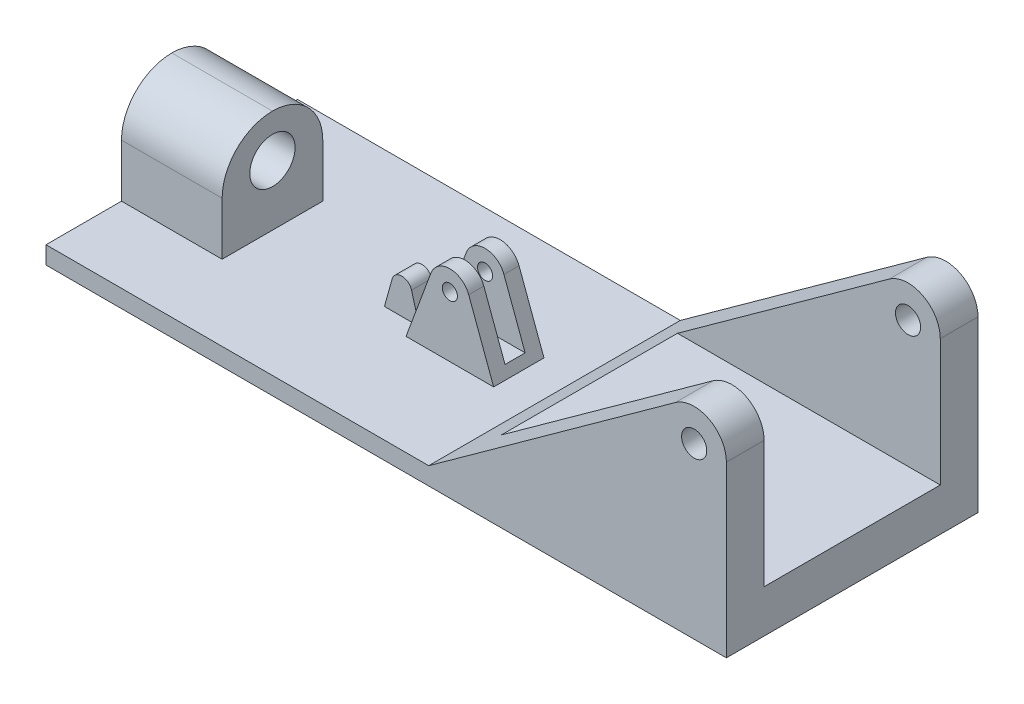
ISO-10303-21;
HEADER;
FILE_DESCRIPTION(('STEP AP214'),'2;1');
FILE_NAME('part.step','',(''),(''),'','','');
FILE_SCHEMA(('AUTOMOTIVE_DESIGN { 1 0 10303 214 1 1 1 1 }'));
ENDSEC;
DATA;
#1=APPLICATION_CONTEXT('core data for automotive mechanical design processes');
#2=APPLICATION_PROTOCOL_DEFINITION('international standard','automotive_design',2000,#1);
#3=PRODUCT_CONTEXT('',#1,'mechanical');
#4=PRODUCT('Part','Part','',(#3));
#5=PRODUCT_RELATED_PRODUCT_CATEGORY('part','',(#4));
#6=PRODUCT_DEFINITION_FORMATION('','',#4);
#7=PRODUCT_DEFINITION_CONTEXT('part definition',#1,'design');
#8=PRODUCT_DEFINITION('design','',#6,#7);
#9=PRODUCT_DEFINITION_SHAPE('','',#8);
#10=(LENGTH_UNIT() NAMED_UNIT(*) SI_UNIT(.MILLI.,.METRE.));
#11=(NAMED_UNIT(*) PLANE_ANGLE_UNIT() SI_UNIT($,.RADIAN.));
#12=(NAMED_UNIT(*) SI_UNIT($,.STERADIAN.) SOLID_ANGLE_UNIT());
#13=UNCERTAINTY_MEASURE_WITH_UNIT(LENGTH_MEASURE(1.E-05),#10,'distance_accuracy_value','');
#14=(GEOMETRIC_REPRESENTATION_CONTEXT(3) GLOBAL_UNCERTAINTY_ASSIGNED_CONTEXT((#13)) GLOBAL_UNIT_ASSIGNED_CONTEXT((#10,
#11,#12)) REPRESENTATION_CONTEXT('',''));
#15=CARTESIAN_POINT('',(0.,0.,0.));
#16=DIRECTION('',(0.,0.,1.));
#17=DIRECTION('',(1.,0.,0.));
#18=AXIS2_PLACEMENT_3D('',#15,#16,#17);
#19=CARTESIAN_POINT('',(26.2618544475775,29.8593260853451,31.75));
#20=DIRECTION('',(1.,0.,0.));
#21=DIRECTION('',(0.,1.,0.));
#22=AXIS2_PLACEMENT_3D('',#19,#20,#21);
#23=PLANE('',#22);
#24=DIRECTION('',(0.,0.,-1.));
#25=VECTOR('',#24,1.);
#26=CARTESIAN_POINT('',(26.2618544475774,68.1879260853451,31.75));
#27=LINE('',#26,#25);
#28=CARTESIAN_POINT('',(26.2618544475774,68.1879260853451,-22.225));
#29=VERTEX_POINT('',#28);
#30=CARTESIAN_POINT('',(26.2618544475774,68.1879260853451,-31.75));
#31=VERTEX_POINT('',#30);
#32=EDGE_CURVE('E341',#29,#31,#27,.T.);
#33=ORIENTED_EDGE('',*,*,#32,.F.);
#34=DIRECTION('',(0.,-1.,0.));
#35=VECTOR('',#34,1.);
#36=CARTESIAN_POINT('',(26.2618544475774,68.1879260853451,-22.225));
#37=LINE('',#36,#35);
#38=CARTESIAN_POINT('',(26.2618544475774,36.2093260853451,-22.225));
#39=VERTEX_POINT('',#38);
#40=EDGE_CURVE('E276',#29,#39,#37,.T.);
#41=ORIENTED_EDGE('',*,*,#40,.T.);
#42=DIRECTION('',(0.,0.,1.));
#43=VECTOR('',#42,1.);
#44=CARTESIAN_POINT('',(26.2618544475774,36.2093260853451,-22.225));
#45=LINE('',#44,#43);
#46=CARTESIAN_POINT('',(26.2618544475774,36.2093260853451,22.225));
#47=VERTEX_POINT('',#46);
#48=EDGE_CURVE('E286',#39,#47,#45,.T.);
#49=ORIENTED_EDGE('',*,*,#48,.T.);
#50=DIRECTION('',(0.,-1.,0.));
#51=VECTOR('',#50,1.);
#52=CARTESIAN_POINT('',(26.2618544475774,68.1879260853451,22.225));
#53=LINE('',#52,#51);
#54=CARTESIAN_POINT('',(26.2618544475774,68.1879260853451,22.225));
#55=VERTEX_POINT('',#54);
#56=EDGE_CURVE('E270',#55,#47,#53,.T.);
#57=ORIENTED_EDGE('',*,*,#56,.F.);
#58=CARTESIAN_POINT('',(26.2618544475774,68.1879260853451,31.75));
#59=VERTEX_POINT('',#58);
#60=EDGE_CURVE('E342',#59,#55,#27,.T.);
#61=ORIENTED_EDGE('',*,*,#60,.F.);
#62=DIRECTION('',(0.,-1.,0.));
#63=VECTOR('',#62,1.);
#64=CARTESIAN_POINT('',(26.2618544475775,29.8593260853451,31.75));
#65=LINE('',#64,#63);
#66=CARTESIAN_POINT('',(26.2618544475774,25.4143260853451,31.75));
#67=VERTEX_POINT('',#66);
#68=EDGE_CURVE('E399',#59,#67,#65,.T.);
#69=ORIENTED_EDGE('',*,*,#68,.T.);
#70=DIRECTION('',(0.,0.,-1.));
#71=VECTOR('',#70,1.);
#72=CARTESIAN_POINT('',(26.2618544475774,25.4143260853451,31.75));
#73=LINE('',#72,#71);
#74=CARTESIAN_POINT('',(26.2618544475774,25.4143260853451,-31.75));
#75=VERTEX_POINT('',#74);
#76=EDGE_CURVE('E417',#67,#75,#73,.T.);
#77=ORIENTED_EDGE('',*,*,#76,.T.);
#78=DIRECTION('',(0.,-1.,0.));
#79=VECTOR('',#78,1.);
#80=CARTESIAN_POINT('',(26.2618544475775,29.8593260853451,-31.75));
#81=LINE('',#80,#79);
#82=EDGE_CURVE('E409',#31,#75,#81,.T.);
#83=ORIENTED_EDGE('',*,*,#82,.F.);
#84=EDGE_LOOP('',(#33,#41,#49,#57,#61,#69,#77,#83));
#85=FACE_BOUND('',#84,.T.);
#86=ADVANCED_FACE('F41',(#85),#23,.T.);
#87=CARTESIAN_POINT('',(13.3770291842014,74.7786011200975,31.75));
#88=DIRECTION('',(0.585239328663388,-0.810860609590592,0.));
#89=DIRECTION('',(0.810860609590592,0.585239328663388,0.));
#90=AXIS2_PLACEMENT_3D('',#87,#88,#89);
#91=PLANE('',#90);
#92=DIRECTION('',(-0.810860609590592,-0.585239328663388,0.));
#93=VECTOR('',#92,1.);
#94=CARTESIAN_POINT('',(13.3770291842014,74.7786011200975,-22.225));
#95=LINE('',#94,#93);
#96=CARTESIAN_POINT('',(13.3770291842014,74.7786011200975,-22.225));
#97=VERTEX_POINT('',#96);
#98=CARTESIAN_POINT('',(-40.0614605659202,36.2093260853451,-22.225));
#99=VERTEX_POINT('',#98);
#100=EDGE_CURVE('E269',#97,#99,#95,.T.);
#101=ORIENTED_EDGE('',*,*,#100,.F.);
#102=DIRECTION('',(0.,0.,-1.));
#103=VECTOR('',#102,1.);
#104=CARTESIAN_POINT('',(13.3770291842014,74.7786011200975,31.75));
#105=LINE('',#104,#103);
#106=CARTESIAN_POINT('',(13.3770291842014,74.7786011200975,-31.75));
#107=VERTEX_POINT('',#106);
#108=EDGE_CURVE('E333',#97,#107,#105,.T.);
#109=ORIENTED_EDGE('',*,*,#108,.T.);
#110=DIRECTION('',(-0.810860609590592,-0.585239328663388,0.));
#111=VECTOR('',#110,1.);
#112=CARTESIAN_POINT('',(13.3770291842014,74.7786011200975,-31.75));
#113=LINE('',#112,#111);
#114=CARTESIAN_POINT('',(-48.8595105579804,29.8593260853451,-31.75));
#115=VERTEX_POINT('',#114);
#116=EDGE_CURVE('E322',#107,#115,#113,.T.);
#117=ORIENTED_EDGE('',*,*,#116,.T.);
#118=DIRECTION('',(0.,0.,-1.));
#119=VECTOR('',#118,1.);
#120=CARTESIAN_POINT('',(-48.8595105579804,29.8593260853451,31.75));
#121=LINE('',#120,#119);
#122=CARTESIAN_POINT('',(-48.8595105579804,29.8593260853451,31.75));
#123=VERTEX_POINT('',#122);
#124=EDGE_CURVE('E345',#123,#115,#121,.T.);
#125=ORIENTED_EDGE('',*,*,#124,.F.);
#126=DIRECTION('',(-0.810860609590592,-0.585239328663388,0.));
#127=VECTOR('',#126,1.);
#128=CARTESIAN_POINT('',(13.3770291842014,74.7786011200975,31.75));
#129=LINE('',#128,#127);
#130=CARTESIAN_POINT('',(13.3770291842014,74.7786011200975,31.75));
#131=VERTEX_POINT('',#130);
#132=EDGE_CURVE('E327',#131,#123,#129,.T.);
#133=ORIENTED_EDGE('',*,*,#132,.F.);
#134=CARTESIAN_POINT('',(13.3770291842014,74.7786011200975,22.225));
#135=VERTEX_POINT('',#134);
#136=EDGE_CURVE('E338',#131,#135,#105,.T.);
#137=ORIENTED_EDGE('',*,*,#136,.T.);
#138=DIRECTION('',(-0.810860609590592,-0.585239328663388,0.));
#139=VECTOR('',#138,1.);
#140=CARTESIAN_POINT('',(13.3770291842014,74.7786011200975,22.225));
#141=LINE('',#140,#139);
#142=CARTESIAN_POINT('',(-40.0614605659202,36.2093260853451,22.225));
#143=VERTEX_POINT('',#142);
#144=EDGE_CURVE('E66',#135,#143,#141,.T.);
#145=ORIENTED_EDGE('',*,*,#144,.T.);
#146=DIRECTION('',(0.,0.,1.));
#147=VECTOR('',#146,1.);
#148=CARTESIAN_POINT('',(-40.0614605659202,36.2093260853451,-22.225));
#149=LINE('',#148,#147);
#150=EDGE_CURVE('E279',#99,#143,#149,.T.);
#151=ORIENTED_EDGE('',*,*,#150,.F.);
#152=EDGE_LOOP('',(#101,#109,#117,#125,#133,#137,#145,#151));
#153=FACE_BOUND('',#152,.T.);
#154=ADVANCED_FACE('F478',(#153),#91,.F.);
#155=CARTESIAN_POINT('',(18.1338544475774,68.1879260853451,31.75));
#156=DIRECTION('',(0.,0.,-1.));
#157=DIRECTION('',(-1.,0.,0.));
#158=AXIS2_PLACEMENT_3D('',#155,#156,#157);
#159=CYLINDRICAL_SURFACE('',#158,8.12800000000001);
#160=CARTESIAN_POINT('',(18.1338544475774,68.1879260853451,-22.225));
#161=DIRECTION('',(0.,0.,1.));
#162=DIRECTION('',(1.,0.,0.));
#163=AXIS2_PLACEMENT_3D('',#160,#161,#162);
#164=CIRCLE('',#163,8.12800000000001);
#165=EDGE_CURVE('E267',#29,#97,#164,.T.);
#166=ORIENTED_EDGE('',*,*,#165,.F.);
#167=ORIENTED_EDGE('',*,*,#32,.T.);
#168=CARTESIAN_POINT('',(18.1338544475774,68.1879260853451,-31.75));
#169=DIRECTION('',(0.,0.,1.));
#170=DIRECTION('',(1.,0.,0.));
#171=AXIS2_PLACEMENT_3D('',#168,#169,#170);
#172=CIRCLE('',#171,8.12800000000001);
#173=EDGE_CURVE('E331',#31,#107,#172,.T.);
#174=ORIENTED_EDGE('',*,*,#173,.T.);
#175=ORIENTED_EDGE('',*,*,#108,.F.);
#176=EDGE_LOOP('',(#166,#167,#174,#175));
#177=FACE_BOUND('',#176,.T.);
#178=ADVANCED_FACE('F479',(#177),#159,.T.);
#179=CARTESIAN_POINT('',(18.1338544475774,68.1879260853451,31.75));
#180=DIRECTION('',(0.,0.,-1.));
#181=DIRECTION('',(-1.,0.,0.));
#182=AXIS2_PLACEMENT_3D('',#179,#180,#181);
#183=CYLINDRICAL_SURFACE('',#182,3.175);
#184=CARTESIAN_POINT('',(18.1338544475774,68.1879260853451,-31.75));
#185=DIRECTION('',(0.,0.,1.));
#186=DIRECTION('',(1.,0.,0.));
#187=AXIS2_PLACEMENT_3D('',#184,#185,#186);
#188=CIRCLE('',#187,3.175);
#189=CARTESIAN_POINT('',(21.3088544475774,68.1879260853451,-31.75));
#190=VERTEX_POINT('',#189);
#191=EDGE_CURVE('E323',#190,#190,#188,.T.);
#192=ORIENTED_EDGE('',*,*,#191,.F.);
#193=EDGE_LOOP('',(#192));
#194=FACE_BOUND('',#193,.T.);
#195=CARTESIAN_POINT('',(18.1338544475774,68.1879260853451,-22.225));
#196=DIRECTION('',(0.,0.,1.));
#197=DIRECTION('',(1.,0.,0.));
#198=AXIS2_PLACEMENT_3D('',#195,#196,#197);
#199=CIRCLE('',#198,3.175);
#200=CARTESIAN_POINT('',(21.3088544475774,68.1879260853451,-22.225));
#201=VERTEX_POINT('',#200);
#202=EDGE_CURVE('E45',#201,#201,#199,.T.);
#203=ORIENTED_EDGE('',*,*,#202,.T.);
#204=EDGE_LOOP('',(#203));
#205=FACE_BOUND('',#204,.T.);
#206=ADVANCED_FACE('F463',(#194,#205),#183,.F.);
#207=CARTESIAN_POINT('',(-64.1629274690311,46.8592840356696,6.35));
#208=DIRECTION('',(0.937846079407757,0.347051482260917,0.));
#209=DIRECTION('',(-0.347051482260917,0.937846079407757,0.));
#210=AXIS2_PLACEMENT_3D('',#207,#208,#209);
#211=PLANE('',#210);
#212=DIRECTION('',(0.,0.,-1.));
#213=VECTOR('',#212,1.);
#214=CARTESIAN_POINT('',(-64.1629274690311,46.8592840356696,6.35));
#215=LINE('',#214,#213);
#216=CARTESIAN_POINT('',(-64.1629274690311,46.8592840356696,-2.54));
#217=VERTEX_POINT('',#216);
#218=CARTESIAN_POINT('',(-64.1629274690311,46.8592840356696,-6.35));
#219=VERTEX_POINT('',#218);
#220=EDGE_CURVE('E374',#217,#219,#215,.T.);
#221=ORIENTED_EDGE('',*,*,#220,.F.);
#222=DIRECTION('',(-0.347051482260917,0.937846079407757,0.));
#223=VECTOR('',#222,1.);
#224=CARTESIAN_POINT('',(-58.8119962765057,32.3993260853451,-2.54));
#225=LINE('',#224,#223);
#226=CARTESIAN_POINT('',(-58.8119962765057,32.3993260853451,-2.54));
#227=VERTEX_POINT('',#226);
#228=EDGE_CURVE('E300',#227,#217,#225,.T.);
#229=ORIENTED_EDGE('',*,*,#228,.F.);
#230=DIRECTION('',(0.,0.,1.));
#231=VECTOR('',#230,1.);
#232=CARTESIAN_POINT('',(-58.8119962765057,32.3993260853451,-2.54));
#233=LINE('',#232,#231);
#234=CARTESIAN_POINT('',(-58.8119962765057,32.3993260853451,2.54));
#235=VERTEX_POINT('',#234);
#236=EDGE_CURVE('E313',#227,#235,#233,.T.);
#237=ORIENTED_EDGE('',*,*,#236,.T.);
#238=DIRECTION('',(-0.347051482260917,0.937846079407757,0.));
#239=VECTOR('',#238,1.);
#240=CARTESIAN_POINT('',(-58.8119962765057,32.3993260853451,2.54));
#241=LINE('',#240,#239);
#242=CARTESIAN_POINT('',(-64.1629274690311,46.8592840356696,2.54));
#243=VERTEX_POINT('',#242);
#244=EDGE_CURVE('E294',#235,#243,#241,.T.);
#245=ORIENTED_EDGE('',*,*,#244,.T.);
#246=CARTESIAN_POINT('',(-64.1629274690311,46.8592840356696,6.35));
#247=VERTEX_POINT('',#246);
#248=EDGE_CURVE('E370',#247,#243,#215,.T.);
#249=ORIENTED_EDGE('',*,*,#248,.F.);
#250=DIRECTION('',(0.347051482260917,-0.937846079407757,0.));
#251=VECTOR('',#250,1.);
#252=CARTESIAN_POINT('',(-64.1629274690311,46.8592840356696,6.35));
#253=LINE('',#252,#251);
#254=CARTESIAN_POINT('',(-57.8720651041118,29.8593260853451,6.35));
#255=VERTEX_POINT('',#254);
#256=EDGE_CURVE('E354',#247,#255,#253,.T.);
#257=ORIENTED_EDGE('',*,*,#256,.T.);
#258=DIRECTION('',(0.,0.,-1.));
#259=VECTOR('',#258,1.);
#260=CARTESIAN_POINT('',(-57.8720651041118,29.8593260853451,31.75));
#261=LINE('',#260,#259);
#262=CARTESIAN_POINT('',(-57.8720651041118,29.8593260853451,-6.35));
#263=VERTEX_POINT('',#262);
#264=EDGE_CURVE('E439',#255,#263,#261,.T.);
#265=ORIENTED_EDGE('',*,*,#264,.T.);
#266=DIRECTION('',(0.347051482260917,-0.937846079407757,0.));
#267=VECTOR('',#266,1.);
#268=CARTESIAN_POINT('',(-64.1629274690311,46.8592840356696,-6.35));
#269=LINE('',#268,#267);
#270=EDGE_CURVE('E351',#219,#263,#269,.T.);
#271=ORIENTED_EDGE('',*,*,#270,.F.);
#272=EDGE_LOOP('',(#221,#229,#237,#245,#249,#257,#265,#271));
#273=FACE_BOUND('',#272,.T.);
#274=ADVANCED_FACE('F625',(#273),#211,.T.);
#275=CARTESIAN_POINT('',(-68.9271855524226,45.096262505784,6.35));
#276=DIRECTION('',(0.,0.,-1.));
#277=DIRECTION('',(-1.,0.,0.));
#278=AXIS2_PLACEMENT_3D('',#275,#276,#277);
#279=CYLINDRICAL_SURFACE('',#278,5.08000000000008);
#280=CARTESIAN_POINT('',(-68.9271855524226,45.096262505784,-2.54));
#281=DIRECTION('',(0.,0.,1.));
#282=DIRECTION('',(1.,0.,0.));
#283=AXIS2_PLACEMENT_3D('',#280,#281,#282);
#284=CIRCLE('',#283,5.08000000000009);
#285=CARTESIAN_POINT('',(-73.691443635814,46.8592840356696,-2.54));
#286=VERTEX_POINT('',#285);
#287=EDGE_CURVE('E291',#217,#286,#284,.T.);
#288=ORIENTED_EDGE('',*,*,#287,.F.);
#289=ORIENTED_EDGE('',*,*,#220,.T.);
#290=CARTESIAN_POINT('',(-68.9271855524226,45.096262505784,-6.35));
#291=DIRECTION('',(0.,0.,1.));
#292=DIRECTION('',(1.,0.,0.));
#293=AXIS2_PLACEMENT_3D('',#290,#291,#292);
#294=CIRCLE('',#293,5.08000000000008);
#295=CARTESIAN_POINT('',(-73.691443635814,46.8592840356696,-6.35));
#296=VERTEX_POINT('',#295);
#297=EDGE_CURVE('E358',#219,#296,#294,.T.);
#298=ORIENTED_EDGE('',*,*,#297,.T.);
#299=DIRECTION('',(0.,0.,-1.));
#300=VECTOR('',#299,1.);
#301=CARTESIAN_POINT('',(-73.691443635814,46.8592840356696,6.35));
#302=LINE('',#301,#300);
#303=EDGE_CURVE('E363',#286,#296,#302,.T.);
#304=ORIENTED_EDGE('',*,*,#303,.F.);
#305=EDGE_LOOP('',(#288,#289,#298,#304));
#306=FACE_BOUND('',#305,.T.);
#307=ADVANCED_FACE('F630',(#306),#279,.T.);
#308=CARTESIAN_POINT('',(-73.691443635814,46.8592840356696,6.35));
#309=DIRECTION('',(0.937846079407758,-0.347051482260915,0.));
#310=DIRECTION('',(0.347051482260915,0.937846079407758,0.));
#311=AXIS2_PLACEMENT_3D('',#308,#309,#310);
#312=PLANE('',#311);
#313=DIRECTION('',(-0.347051482260913,-0.937846079407758,0.));
#314=VECTOR('',#313,1.);
#315=CARTESIAN_POINT('',(-73.691443635814,46.8592840356696,-2.54));
#316=LINE('',#315,#314);
#317=CARTESIAN_POINT('',(-79.0423748283394,32.3993260853451,-2.54));
#318=VERTEX_POINT('',#317);
#319=EDGE_CURVE('E293',#286,#318,#316,.T.);
#320=ORIENTED_EDGE('',*,*,#319,.F.);
#321=ORIENTED_EDGE('',*,*,#303,.T.);
#322=DIRECTION('',(-0.347051482260915,-0.937846079407758,0.));
#323=VECTOR('',#322,1.);
#324=CARTESIAN_POINT('',(-73.691443635814,46.8592840356696,-6.35));
#325=LINE('',#324,#323);
#326=CARTESIAN_POINT('',(-79.9823060007333,29.8593260853451,-6.35));
#327=VERTEX_POINT('',#326);
#328=EDGE_CURVE('E366',#296,#327,#325,.T.);
#329=ORIENTED_EDGE('',*,*,#328,.T.);
#330=DIRECTION('',(0.,0.,-1.));
#331=VECTOR('',#330,1.);
#332=CARTESIAN_POINT('',(-79.9823060007333,29.8593260853451,31.75));
#333=LINE('',#332,#331);
#334=CARTESIAN_POINT('',(-79.9823060007333,29.8593260853451,6.35));
#335=VERTEX_POINT('',#334);
#336=EDGE_CURVE('E431',#335,#327,#333,.T.);
#337=ORIENTED_EDGE('',*,*,#336,.F.);
#338=DIRECTION('',(-0.347051482260915,-0.937846079407758,0.));
#339=VECTOR('',#338,1.);
#340=CARTESIAN_POINT('',(-73.691443635814,46.8592840356696,6.35));
#341=LINE('',#340,#339);
#342=CARTESIAN_POINT('',(-73.691443635814,46.8592840356696,6.35));
#343=VERTEX_POINT('',#342);
#344=EDGE_CURVE('E357',#343,#335,#341,.T.);
#345=ORIENTED_EDGE('',*,*,#344,.F.);
#346=CARTESIAN_POINT('',(-73.691443635814,46.8592840356696,2.54));
#347=VERTEX_POINT('',#346);
#348=EDGE_CURVE('E375',#343,#347,#302,.T.);
#349=ORIENTED_EDGE('',*,*,#348,.T.);
#350=DIRECTION('',(-0.347051482260913,-0.937846079407758,0.));
#351=VECTOR('',#350,1.);
#352=CARTESIAN_POINT('',(-73.691443635814,46.8592840356696,2.54));
#353=LINE('',#352,#351);
#354=CARTESIAN_POINT('',(-79.0423748283394,32.3993260853451,2.54));
#355=VERTEX_POINT('',#354);
#356=EDGE_CURVE('E306',#347,#355,#353,.T.);
#357=ORIENTED_EDGE('',*,*,#356,.T.);
#358=DIRECTION('',(0.,0.,1.));
#359=VECTOR('',#358,1.);
#360=CARTESIAN_POINT('',(-79.0423748283394,32.3993260853451,-2.54));
#361=LINE('',#360,#359);
#362=EDGE_CURVE('E302',#318,#355,#361,.T.);
#363=ORIENTED_EDGE('',*,*,#362,.F.);
#364=EDGE_LOOP('',(#320,#321,#329,#337,#345,#349,#357,#363));
#365=FACE_BOUND('',#364,.T.);
#366=ADVANCED_FACE('F643',(#365),#312,.F.);
#367=CARTESIAN_POINT('',(-68.9271855524226,45.096262505784,6.35));
#368=DIRECTION('',(0.,0.,-1.));
#369=DIRECTION('',(-1.,0.,0.));
#370=AXIS2_PLACEMENT_3D('',#367,#368,#369);
#371=CYLINDRICAL_SURFACE('',#370,1.90500000000001);
#372=CARTESIAN_POINT('',(-68.9271855524226,45.096262505784,-6.35));
#373=DIRECTION('',(0.,0.,1.));
#374=DIRECTION('',(1.,0.,0.));
#375=AXIS2_PLACEMENT_3D('',#372,#373,#374);
#376=CIRCLE('',#375,1.90500000000001);
#377=CARTESIAN_POINT('',(-67.0221855524226,45.096262505784,-6.35));
#378=VERTEX_POINT('',#377);
#379=EDGE_CURVE('E347',#378,#378,#376,.T.);
#380=ORIENTED_EDGE('',*,*,#379,.F.);
#381=EDGE_LOOP('',(#380));
#382=FACE_BOUND('',#381,.T.);
#383=CARTESIAN_POINT('',(-68.9271855524226,45.096262505784,-2.54));
#384=DIRECTION('',(0.,0.,1.));
#385=DIRECTION('',(1.,0.,0.));
#386=AXIS2_PLACEMENT_3D('',#383,#384,#385);
#387=CIRCLE('',#386,1.90500000000001);
#388=CARTESIAN_POINT('',(-67.0221855524226,45.096262505784,-2.54));
#389=VERTEX_POINT('',#388);
#390=EDGE_CURVE('E453',#389,#389,#387,.T.);
#391=ORIENTED_EDGE('',*,*,#390,.T.);
#392=EDGE_LOOP('',(#391));
#393=FACE_BOUND('',#392,.T.);
#394=ADVANCED_FACE('F655',(#382,#393),#371,.F.);
#395=CARTESIAN_POINT('',(-145.442145552423,29.8593260853451,31.75));
#396=DIRECTION('',(0.,1.,0.));
#397=DIRECTION('',(0.,0.,1.));
#398=AXIS2_PLACEMENT_3D('',#395,#396,#397);
#399=PLANE('',#398);
#400=DIRECTION('',(1.,0.,0.));
#401=VECTOR('',#400,1.);
#402=CARTESIAN_POINT('',(-145.442145552423,29.8593260853451,2.54));
#403=LINE('',#402,#401);
#404=CARTESIAN_POINT('',(-89.2453210796141,29.8593260853451,2.54));
#405=VERTEX_POINT('',#404);
#406=CARTESIAN_POINT('',(-80.4606500252311,29.8593260853451,2.54));
#407=VERTEX_POINT('',#406);
#408=EDGE_CURVE('E229',#405,#407,#403,.T.);
#409=ORIENTED_EDGE('',*,*,#408,.F.);
#410=DIRECTION('',(0.,0.,-1.));
#411=VECTOR('',#410,1.);
#412=CARTESIAN_POINT('',(-89.2453210796141,29.8593260853451,31.75));
#413=LINE('',#412,#411);
#414=CARTESIAN_POINT('',(-89.2453210796141,29.8593260853451,-2.54));
#415=VERTEX_POINT('',#414);
#416=EDGE_CURVE('E263',#405,#415,#413,.T.);
#417=ORIENTED_EDGE('',*,*,#416,.T.);
#418=DIRECTION('',(1.,0.,0.));
#419=VECTOR('',#418,1.);
#420=CARTESIAN_POINT('',(-145.442145552423,29.8593260853451,-2.54));
#421=LINE('',#420,#419);
#422=CARTESIAN_POINT('',(-80.4606500252311,29.8593260853451,-2.54));
#423=VERTEX_POINT('',#422);
#424=EDGE_CURVE('E238',#415,#423,#421,.T.);
#425=ORIENTED_EDGE('',*,*,#424,.T.);
#426=DIRECTION('',(0.,0.,1.));
#427=VECTOR('',#426,1.);
#428=CARTESIAN_POINT('',(-80.4606500252311,29.8593260853451,31.75));
#429=LINE('',#428,#427);
#430=EDGE_CURVE('E261',#423,#407,#429,.T.);
#431=ORIENTED_EDGE('',*,*,#430,.T.);
#432=EDGE_LOOP('',(#409,#417,#425,#431));
#433=FACE_BOUND('',#432,.T.);
#434=ORIENTED_EDGE('',*,*,#264,.F.);
#435=DIRECTION('',(1.,0.,0.));
#436=VECTOR('',#435,1.);
#437=CARTESIAN_POINT('',(-145.442145552423,29.8593260853451,6.35));
#438=LINE('',#437,#436);
#439=EDGE_CURVE('E437',#335,#255,#438,.T.);
#440=ORIENTED_EDGE('',*,*,#439,.F.);
#441=ORIENTED_EDGE('',*,*,#336,.T.);
#442=DIRECTION('',(1.,0.,0.));
#443=VECTOR('',#442,1.);
#444=CARTESIAN_POINT('',(-145.442145552423,29.8593260853451,-6.35));
#445=LINE('',#444,#443);
#446=EDGE_CURVE('E434',#327,#263,#445,.T.);
#447=ORIENTED_EDGE('',*,*,#446,.T.);
#448=EDGE_LOOP('',(#434,#440,#441,#447));
#449=FACE_BOUND('',#448,.T.);
#450=DIRECTION('',(1.,0.,0.));
#451=VECTOR('',#450,1.);
#452=CARTESIAN_POINT('',(-145.442145552423,29.8593260853451,31.75));
#453=LINE('',#452,#451);
#454=CARTESIAN_POINT('',(-145.442145552423,29.8593260853451,31.75));
#455=VERTEX_POINT('',#454);
#456=EDGE_CURVE('E402',#455,#123,#453,.T.);
#457=ORIENTED_EDGE('',*,*,#456,.T.);
#458=ORIENTED_EDGE('',*,*,#124,.T.);
#459=DIRECTION('',(1.,0.,0.));
#460=VECTOR('',#459,1.);
#461=CARTESIAN_POINT('',(-145.442145552423,29.8593260853451,-31.75));
#462=LINE('',#461,#460);
#463=CARTESIAN_POINT('',(-145.442145552423,29.8593260853451,-31.75));
#464=VERTEX_POINT('',#463);
#465=EDGE_CURVE('E397',#464,#115,#462,.T.);
#466=ORIENTED_EDGE('',*,*,#465,.F.);
#467=DIRECTION('',(0.,0.,-1.));
#468=VECTOR('',#467,1.);
#469=CARTESIAN_POINT('',(-145.442145552423,29.8593260853451,31.75));
#470=LINE('',#469,#468);
#471=CARTESIAN_POINT('',(-145.442145552423,29.8593260853451,-12.7));
#472=VERTEX_POINT('',#471);
#473=EDGE_CURVE('E404',#472,#464,#470,.T.);
#474=ORIENTED_EDGE('',*,*,#473,.F.);
#475=DIRECTION('',(1.,0.,0.));
#476=VECTOR('',#475,1.);
#477=CARTESIAN_POINT('',(-145.442145552423,29.8593260853451,-12.7));
#478=LINE('',#477,#476);
#479=CARTESIAN_POINT('',(-120.042145552423,29.8593260853451,-12.7));
#480=VERTEX_POINT('',#479);
#481=EDGE_CURVE('E422',#472,#480,#478,.T.);
#482=ORIENTED_EDGE('',*,*,#481,.T.);
#483=DIRECTION('',(0.,0.,-1.));
#484=VECTOR('',#483,1.);
#485=CARTESIAN_POINT('',(-120.042145552423,29.8593260853451,31.75));
#486=LINE('',#485,#484);
#487=CARTESIAN_POINT('',(-120.042145552423,29.8593260853451,12.7));
#488=VERTEX_POINT('',#487);
#489=EDGE_CURVE('E425',#488,#480,#486,.T.);
#490=ORIENTED_EDGE('',*,*,#489,.F.);
#491=DIRECTION('',(1.,0.,0.));
#492=VECTOR('',#491,1.);
#493=CARTESIAN_POINT('',(-145.442145552423,29.8593260853451,12.7));
#494=LINE('',#493,#492);
#495=CARTESIAN_POINT('',(-145.442145552423,29.8593260853451,12.7));
#496=VERTEX_POINT('',#495);
#497=EDGE_CURVE('E428',#496,#488,#494,.T.);
#498=ORIENTED_EDGE('',*,*,#497,.F.);
#499=EDGE_CURVE('E414',#455,#496,#470,.T.);
#500=ORIENTED_EDGE('',*,*,#499,.F.);
#501=EDGE_LOOP('',(#457,#458,#466,#474,#482,#490,#498,#500));
#502=FACE_BOUND('',#501,.T.);
#503=ADVANCED_FACE('F522',(#433,#449,#502),#399,.T.);
#504=CARTESIAN_POINT('',(-145.442145552423,29.8593260853451,31.75));
#505=DIRECTION('',(1.,0.,0.));
#506=DIRECTION('',(0.,0.,-1.));
#507=AXIS2_PLACEMENT_3D('',#504,#505,#506);
#508=PLANE('',#507);
#509=CARTESIAN_POINT('',(-145.442145552423,45.0962625057841,0.));
#510=DIRECTION('',(1.,0.,0.));
#511=DIRECTION('',(0.,0.,-1.));
#512=AXIS2_PLACEMENT_3D('',#509,#510,#511);
#513=CIRCLE('',#512,5.71500000000002);
#514=CARTESIAN_POINT('',(-145.442145552423,45.0962625057841,-5.715));
#515=VERTEX_POINT('',#514);
#516=EDGE_CURVE('E378',#515,#515,#513,.T.);
#517=ORIENTED_EDGE('',*,*,#516,.T.);
#518=EDGE_LOOP('',(#517));
#519=FACE_BOUND('',#518,.T.);
#520=DIRECTION('',(0.,-1.,0.));
#521=VECTOR('',#520,1.);
#522=CARTESIAN_POINT('',(-145.442145552423,55.8943260853451,12.7));
#523=LINE('',#522,#521);
#524=CARTESIAN_POINT('',(-145.442145552423,43.1943260853451,12.7));
#525=VERTEX_POINT('',#524);
#526=EDGE_CURVE('E387',#525,#496,#523,.T.);
#527=ORIENTED_EDGE('',*,*,#526,.F.);
#528=CARTESIAN_POINT('',(-145.442145552423,43.1943260853451,0.));
#529=DIRECTION('',(1.,0.,0.));
#530=DIRECTION('',(0.,0.,-1.));
#531=AXIS2_PLACEMENT_3D('',#528,#529,#530);
#532=CIRCLE('',#531,12.7);
#533=CARTESIAN_POINT('',(-145.442145552423,55.8943260853451,0.));
#534=VERTEX_POINT('',#533);
#535=EDGE_CURVE('E50',#525,#534,#532,.F.);
#536=ORIENTED_EDGE('',*,*,#535,.T.);
#537=CARTESIAN_POINT('',(-145.442145552423,43.1943260853451,0.));
#538=DIRECTION('',(1.,0.,0.));
#539=DIRECTION('',(0.,0.,-1.));
#540=AXIS2_PLACEMENT_3D('',#537,#538,#539);
#541=CIRCLE('',#540,12.7);
#542=CARTESIAN_POINT('',(-145.442145552423,43.1943260853451,-12.7));
#543=VERTEX_POINT('',#542);
#544=EDGE_CURVE('E448',#534,#543,#541,.F.);
#545=ORIENTED_EDGE('',*,*,#544,.T.);
#546=DIRECTION('',(0.,-1.,0.));
#547=VECTOR('',#546,1.);
#548=CARTESIAN_POINT('',(-145.442145552423,55.8943260853451,-12.7));
#549=LINE('',#548,#547);
#550=EDGE_CURVE('E388',#543,#472,#549,.T.);
#551=ORIENTED_EDGE('',*,*,#550,.T.);
#552=ORIENTED_EDGE('',*,*,#473,.T.);
#553=DIRECTION('',(0.,-1.,0.));
#554=VECTOR('',#553,1.);
#555=CARTESIAN_POINT('',(-145.442145552423,29.8593260853451,-31.75));
#556=LINE('',#555,#554);
#557=CARTESIAN_POINT('',(-145.442145552423,25.4143260853451,-31.75));
#558=VERTEX_POINT('',#557);
#559=EDGE_CURVE('E390',#464,#558,#556,.T.);
#560=ORIENTED_EDGE('',*,*,#559,.T.);
#561=DIRECTION('',(0.,0.,-1.));
#562=VECTOR('',#561,1.);
#563=CARTESIAN_POINT('',(-145.442145552423,25.4143260853451,31.75));
#564=LINE('',#563,#562);
#565=CARTESIAN_POINT('',(-145.442145552423,25.4143260853451,31.75));
#566=VERTEX_POINT('',#565);
#567=EDGE_CURVE('E420',#566,#558,#564,.T.);
#568=ORIENTED_EDGE('',*,*,#567,.F.);
#569=DIRECTION('',(0.,-1.,0.));
#570=VECTOR('',#569,1.);
#571=CARTESIAN_POINT('',(-145.442145552423,29.8593260853451,31.75));
#572=LINE('',#571,#570);
#573=EDGE_CURVE('E393',#455,#566,#572,.T.);
#574=ORIENTED_EDGE('',*,*,#573,.F.);
#575=ORIENTED_EDGE('',*,*,#499,.T.);
#576=EDGE_LOOP('',(#527,#536,#545,#551,#552,#560,#568,#574,#575));
#577=FACE_BOUND('',#576,.T.);
#578=ADVANCED_FACE('F527',(#519,#577),#508,.F.);
#579=CARTESIAN_POINT('',(-145.442145552423,25.4143260853451,31.75));
#580=DIRECTION('',(0.,1.,0.));
#581=DIRECTION('',(0.,0.,1.));
#582=AXIS2_PLACEMENT_3D('',#579,#580,#581);
#583=PLANE('',#582);
#584=ORIENTED_EDGE('',*,*,#76,.F.);
#585=DIRECTION('',(1.,0.,0.));
#586=VECTOR('',#585,1.);
#587=CARTESIAN_POINT('',(-145.442145552423,25.4143260853451,31.75));
#588=LINE('',#587,#586);
#589=EDGE_CURVE('E396',#566,#67,#588,.T.);
#590=ORIENTED_EDGE('',*,*,#589,.F.);
#591=ORIENTED_EDGE('',*,*,#567,.T.);
#592=DIRECTION('',(1.,0.,0.));
#593=VECTOR('',#592,1.);
#594=CARTESIAN_POINT('',(-145.442145552423,25.4143260853451,-31.75));
#595=LINE('',#594,#593);
#596=EDGE_CURVE('E407',#558,#75,#595,.T.);
#597=ORIENTED_EDGE('',*,*,#596,.T.);
#598=EDGE_LOOP('',(#584,#590,#591,#597));
#599=FACE_BOUND('',#598,.T.);
#600=ADVANCED_FACE('F524',(#599),#583,.F.);
#601=CARTESIAN_POINT('',(-145.442145552423,25.4143260853451,31.75));
#602=DIRECTION('',(0.,0.,1.));
#603=DIRECTION('',(1.,0.,0.));
#604=AXIS2_PLACEMENT_3D('',#601,#602,#603);
#605=PLANE('',#604);
#606=ORIENTED_EDGE('',*,*,#68,.F.);
#607=CARTESIAN_POINT('',(18.1338544475774,68.1879260853451,31.75));
#608=DIRECTION('',(0.,0.,1.));
#609=DIRECTION('',(1.,0.,0.));
#610=AXIS2_PLACEMENT_3D('',#607,#608,#609);
#611=CIRCLE('',#610,8.12800000000001);
#612=EDGE_CURVE('E330',#59,#131,#611,.T.);
#613=ORIENTED_EDGE('',*,*,#612,.T.);
#614=ORIENTED_EDGE('',*,*,#132,.T.);
#615=ORIENTED_EDGE('',*,*,#456,.F.);
#616=ORIENTED_EDGE('',*,*,#573,.T.);
#617=ORIENTED_EDGE('',*,*,#589,.T.);
#618=EDGE_LOOP('',(#606,#613,#614,#615,#616,#617));
#619=FACE_BOUND('',#618,.T.);
#620=CARTESIAN_POINT('',(18.1338544475774,68.1879260853451,31.75));
#621=DIRECTION('',(0.,0.,1.));
#622=DIRECTION('',(1.,0.,0.));
#623=AXIS2_PLACEMENT_3D('',#620,#621,#622);
#624=CIRCLE('',#623,3.175);
#625=CARTESIAN_POINT('',(21.3088544475774,68.1879260853451,31.75));
#626=VERTEX_POINT('',#625);
#627=EDGE_CURVE('E319',#626,#626,#624,.T.);
#628=ORIENTED_EDGE('',*,*,#627,.F.);
#629=EDGE_LOOP('',(#628));
#630=FACE_BOUND('',#629,.T.);
#631=ADVANCED_FACE('F493',(#619,#630),#605,.T.);
#632=CARTESIAN_POINT('',(-145.442145552423,25.4143260853451,-31.75));
#633=DIRECTION('',(0.,0.,1.));
#634=DIRECTION('',(1.,0.,0.));
#635=AXIS2_PLACEMENT_3D('',#632,#633,#634);
#636=PLANE('',#635);
#637=ORIENTED_EDGE('',*,*,#82,.T.);
#638=ORIENTED_EDGE('',*,*,#596,.F.);
#639=ORIENTED_EDGE('',*,*,#559,.F.);
#640=ORIENTED_EDGE('',*,*,#465,.T.);
#641=ORIENTED_EDGE('',*,*,#116,.F.);
#642=ORIENTED_EDGE('',*,*,#173,.F.);
#643=EDGE_LOOP('',(#637,#638,#639,#640,#641,#642));
#644=FACE_BOUND('',#643,.T.);
#645=ORIENTED_EDGE('',*,*,#191,.T.);
#646=EDGE_LOOP('',(#645));
#647=FACE_BOUND('',#646,.T.);
#648=ADVANCED_FACE('F484',(#644,#647),#636,.F.);
#649=CARTESIAN_POINT('',(-120.042145552423,55.8943260853451,12.7));
#650=DIRECTION('',(1.,0.,0.));
#651=DIRECTION('',(0.,0.,-1.));
#652=AXIS2_PLACEMENT_3D('',#649,#650,#651);
#653=PLANE('',#652);
#654=CARTESIAN_POINT('',(-120.042145552423,45.0962625057841,0.));
#655=DIRECTION('',(1.,0.,0.));
#656=DIRECTION('',(0.,0.,-1.));
#657=AXIS2_PLACEMENT_3D('',#654,#655,#656);
#658=CIRCLE('',#657,5.71500000000002);
#659=CARTESIAN_POINT('',(-120.042145552423,45.0962625057841,-5.715));
#660=VERTEX_POINT('',#659);
#661=EDGE_CURVE('E373',#660,#660,#658,.T.);
#662=ORIENTED_EDGE('',*,*,#661,.F.);
#663=EDGE_LOOP('',(#662));
#664=FACE_BOUND('',#663,.T.);
#665=CARTESIAN_POINT('',(-120.042145552423,43.1943260853451,0.));
#666=DIRECTION('',(1.,0.,0.));
#667=DIRECTION('',(0.,0.,-1.));
#668=AXIS2_PLACEMENT_3D('',#665,#666,#667);
#669=CIRCLE('',#668,12.7);
#670=CARTESIAN_POINT('',(-120.042145552423,43.1943260853451,-12.7));
#671=VERTEX_POINT('',#670);
#672=CARTESIAN_POINT('',(-120.042145552423,55.8943260853451,0.));
#673=VERTEX_POINT('',#672);
#674=EDGE_CURVE('E441',#671,#673,#669,.T.);
#675=ORIENTED_EDGE('',*,*,#674,.T.);
#676=CARTESIAN_POINT('',(-120.042145552423,43.1943260853451,0.));
#677=DIRECTION('',(1.,0.,0.));
#678=DIRECTION('',(0.,0.,-1.));
#679=AXIS2_PLACEMENT_3D('',#676,#677,#678);
#680=CIRCLE('',#679,12.7);
#681=CARTESIAN_POINT('',(-120.042145552423,43.1943260853451,12.7));
#682=VERTEX_POINT('',#681);
#683=EDGE_CURVE('E443',#673,#682,#680,.T.);
#684=ORIENTED_EDGE('',*,*,#683,.T.);
#685=DIRECTION('',(0.,-1.,0.));
#686=VECTOR('',#685,1.);
#687=CARTESIAN_POINT('',(-120.042145552423,55.8943260853451,12.7));
#688=LINE('',#687,#686);
#689=EDGE_CURVE('E385',#682,#488,#688,.T.);
#690=ORIENTED_EDGE('',*,*,#689,.T.);
#691=ORIENTED_EDGE('',*,*,#489,.T.);
#692=DIRECTION('',(0.,-1.,0.));
#693=VECTOR('',#692,1.);
#694=CARTESIAN_POINT('',(-120.042145552423,55.8943260853451,-12.7));
#695=LINE('',#694,#693);
#696=EDGE_CURVE('E382',#671,#480,#695,.T.);
#697=ORIENTED_EDGE('',*,*,#696,.F.);
#698=EDGE_LOOP('',(#675,#684,#690,#691,#697));
#699=FACE_BOUND('',#698,.T.);
#700=ADVANCED_FACE('F560',(#664,#699),#653,.T.);
#701=CARTESIAN_POINT('',(-120.042145552423,25.4143260853451,12.7));
#702=DIRECTION('',(0.,0.,1.));
#703=DIRECTION('',(1.,0.,0.));
#704=AXIS2_PLACEMENT_3D('',#701,#702,#703);
#705=PLANE('',#704);
#706=ORIENTED_EDGE('',*,*,#689,.F.);
#707=DIRECTION('',(1.,0.,0.));
#708=VECTOR('',#707,1.);
#709=CARTESIAN_POINT('',(-120.042145552423,43.1943260853451,12.7));
#710=LINE('',#709,#708);
#711=EDGE_CURVE('E445',#682,#525,#710,.F.);
#712=ORIENTED_EDGE('',*,*,#711,.T.);
#713=ORIENTED_EDGE('',*,*,#526,.T.);
#714=ORIENTED_EDGE('',*,*,#497,.T.);
#715=EDGE_LOOP('',(#706,#712,#713,#714));
#716=FACE_BOUND('',#715,.T.);
#717=ADVANCED_FACE('F551',(#716),#705,.T.);
#718=CARTESIAN_POINT('',(-120.042145552423,25.4143260853451,-12.7));
#719=DIRECTION('',(0.,0.,1.));
#720=DIRECTION('',(1.,0.,0.));
#721=AXIS2_PLACEMENT_3D('',#718,#719,#720);
#722=PLANE('',#721);
#723=ORIENTED_EDGE('',*,*,#550,.F.);
#724=DIRECTION('',(1.,0.,0.));
#725=VECTOR('',#724,1.);
#726=CARTESIAN_POINT('',(-120.042145552423,43.1943260853451,-12.7));
#727=LINE('',#726,#725);
#728=EDGE_CURVE('E11',#543,#671,#727,.T.);
#729=ORIENTED_EDGE('',*,*,#728,.T.);
#730=ORIENTED_EDGE('',*,*,#696,.T.);
#731=ORIENTED_EDGE('',*,*,#481,.F.);
#732=EDGE_LOOP('',(#723,#729,#730,#731));
#733=FACE_BOUND('',#732,.T.);
#734=ADVANCED_FACE('F565',(#733),#722,.F.);
#735=CARTESIAN_POINT('',(-145.442145552423,45.0962625057841,0.));
#736=DIRECTION('',(1.,0.,0.));
#737=DIRECTION('',(0.,0.,-1.));
#738=AXIS2_PLACEMENT_3D('',#735,#736,#737);
#739=CYLINDRICAL_SURFACE('',#738,5.71500000000002);
#740=ORIENTED_EDGE('',*,*,#516,.F.);
#741=EDGE_LOOP('',(#740));
#742=FACE_BOUND('',#741,.T.);
#743=ORIENTED_EDGE('',*,*,#661,.T.);
#744=EDGE_LOOP('',(#743));
#745=FACE_BOUND('',#744,.T.);
#746=ADVANCED_FACE('F569',(#742,#745),#739,.F.);
#747=CARTESIAN_POINT('',(-68.9271855524226,45.096262505784,6.35));
#748=DIRECTION('',(0.,0.,1.));
#749=DIRECTION('',(1.,0.,0.));
#750=AXIS2_PLACEMENT_3D('',#747,#748,#749);
#751=PLANE('',#750);
#752=ORIENTED_EDGE('',*,*,#344,.T.);
#753=ORIENTED_EDGE('',*,*,#439,.T.);
#754=ORIENTED_EDGE('',*,*,#256,.F.);
#755=CARTESIAN_POINT('',(-68.9271855524226,45.096262505784,6.35));
#756=DIRECTION('',(0.,0.,1.));
#757=DIRECTION('',(1.,0.,0.));
#758=AXIS2_PLACEMENT_3D('',#755,#756,#757);
#759=CIRCLE('',#758,5.08000000000008);
#760=EDGE_CURVE('E361',#247,#343,#759,.T.);
#761=ORIENTED_EDGE('',*,*,#760,.T.);
#762=EDGE_LOOP('',(#752,#753,#754,#761));
#763=FACE_BOUND('',#762,.T.);
#764=CARTESIAN_POINT('',(-68.9271855524226,45.096262505784,6.35));
#765=DIRECTION('',(0.,0.,1.));
#766=DIRECTION('',(1.,0.,0.));
#767=AXIS2_PLACEMENT_3D('',#764,#765,#766);
#768=CIRCLE('',#767,1.90500000000001);
#769=CARTESIAN_POINT('',(-67.0221855524226,45.096262505784,6.35));
#770=VERTEX_POINT('',#769);
#771=EDGE_CURVE('E348',#770,#770,#768,.T.);
#772=ORIENTED_EDGE('',*,*,#771,.F.);
#773=EDGE_LOOP('',(#772));
#774=FACE_BOUND('',#773,.T.);
#775=ADVANCED_FACE('F575',(#763,#774),#751,.T.);
#776=CARTESIAN_POINT('',(-68.9271855524226,45.096262505784,-6.35));
#777=DIRECTION('',(0.,0.,1.));
#778=DIRECTION('',(1.,0.,0.));
#779=AXIS2_PLACEMENT_3D('',#776,#777,#778);
#780=PLANE('',#779);
#781=ORIENTED_EDGE('',*,*,#446,.F.);
#782=ORIENTED_EDGE('',*,*,#328,.F.);
#783=ORIENTED_EDGE('',*,*,#297,.F.);
#784=ORIENTED_EDGE('',*,*,#270,.T.);
#785=EDGE_LOOP('',(#781,#782,#783,#784));
#786=FACE_BOUND('',#785,.T.);
#787=ORIENTED_EDGE('',*,*,#379,.T.);
#788=EDGE_LOOP('',(#787));
#789=FACE_BOUND('',#788,.T.);
#790=ADVANCED_FACE('F675',(#786,#789),#780,.F.);
#791=ORIENTED_EDGE('',*,*,#248,.T.);
#792=CARTESIAN_POINT('',(-68.9271855524226,45.096262505784,2.54));
#793=DIRECTION('',(0.,0.,1.));
#794=DIRECTION('',(1.,0.,0.));
#795=AXIS2_PLACEMENT_3D('',#792,#793,#794);
#796=CIRCLE('',#795,5.08000000000009);
#797=EDGE_CURVE('E303',#243,#347,#796,.T.);
#798=ORIENTED_EDGE('',*,*,#797,.T.);
#799=ORIENTED_EDGE('',*,*,#348,.F.);
#800=ORIENTED_EDGE('',*,*,#760,.F.);
#801=EDGE_LOOP('',(#791,#798,#799,#800));
#802=FACE_BOUND('',#801,.T.);
#803=ADVANCED_FACE('F646',(#802),#279,.T.);
#804=CARTESIAN_POINT('',(-68.9271855524226,45.096262505784,2.54));
#805=DIRECTION('',(0.,0.,1.));
#806=DIRECTION('',(1.,0.,0.));
#807=AXIS2_PLACEMENT_3D('',#804,#805,#806);
#808=CIRCLE('',#807,1.90500000000001);
#809=CARTESIAN_POINT('',(-67.0221855524226,45.096262505784,2.54));
#810=VERTEX_POINT('',#809);
#811=EDGE_CURVE('E316',#810,#810,#808,.T.);
#812=ORIENTED_EDGE('',*,*,#811,.F.);
#813=EDGE_LOOP('',(#812));
#814=FACE_BOUND('',#813,.T.);
#815=ORIENTED_EDGE('',*,*,#771,.T.);
#816=EDGE_LOOP('',(#815));
#817=FACE_BOUND('',#816,.T.);
#818=ADVANCED_FACE('F666',(#814,#817),#371,.F.);
#819=ORIENTED_EDGE('',*,*,#60,.T.);
#820=CARTESIAN_POINT('',(18.1338544475774,68.1879260853451,22.225));
#821=DIRECTION('',(0.,0.,1.));
#822=DIRECTION('',(1.,0.,0.));
#823=AXIS2_PLACEMENT_3D('',#820,#821,#822);
#824=CIRCLE('',#823,8.12800000000001);
#825=EDGE_CURVE('E266',#55,#135,#824,.T.);
#826=ORIENTED_EDGE('',*,*,#825,.T.);
#827=ORIENTED_EDGE('',*,*,#136,.F.);
#828=ORIENTED_EDGE('',*,*,#612,.F.);
#829=EDGE_LOOP('',(#819,#826,#827,#828));
#830=FACE_BOUND('',#829,.T.);
#831=ADVANCED_FACE('F499',(#830),#159,.T.);
#832=CARTESIAN_POINT('',(18.1338544475774,68.1879260853451,22.225));
#833=DIRECTION('',(0.,0.,1.));
#834=DIRECTION('',(1.,0.,0.));
#835=AXIS2_PLACEMENT_3D('',#832,#833,#834);
#836=CIRCLE('',#835,3.175);
#837=CARTESIAN_POINT('',(21.3088544475774,68.1879260853451,22.225));
#838=VERTEX_POINT('',#837);
#839=EDGE_CURVE('E289',#838,#838,#836,.T.);
#840=ORIENTED_EDGE('',*,*,#839,.F.);
#841=EDGE_LOOP('',(#840));
#842=FACE_BOUND('',#841,.T.);
#843=ORIENTED_EDGE('',*,*,#627,.T.);
#844=EDGE_LOOP('',(#843));
#845=FACE_BOUND('',#844,.T.);
#846=ADVANCED_FACE('F541',(#842,#845),#183,.F.);
#847=CARTESIAN_POINT('',(-120.042145552423,43.1943260853451,0.));
#848=DIRECTION('',(-1.,0.,0.));
#849=DIRECTION('',(0.,0.,1.));
#850=AXIS2_PLACEMENT_3D('',#847,#848,#849);
#851=CYLINDRICAL_SURFACE('',#850,12.7);
#852=ORIENTED_EDGE('',*,*,#728,.F.);
#853=ORIENTED_EDGE('',*,*,#544,.F.);
#854=DIRECTION('',(1.,0.,0.));
#855=VECTOR('',#854,1.);
#856=CARTESIAN_POINT('',(-145.442145552423,55.8943260853451,0.));
#857=LINE('',#856,#855);
#858=EDGE_CURVE('E326',#673,#534,#857,.F.);
#859=ORIENTED_EDGE('',*,*,#858,.F.);
#860=ORIENTED_EDGE('',*,*,#674,.F.);
#861=EDGE_LOOP('',(#852,#853,#859,#860));
#862=FACE_BOUND('',#861,.T.);
#863=ADVANCED_FACE('F43',(#862),#851,.T.);
#864=CARTESIAN_POINT('',(-145.442145552423,43.1943260853451,0.));
#865=DIRECTION('',(1.,0.,0.));
#866=DIRECTION('',(0.,0.,-1.));
#867=AXIS2_PLACEMENT_3D('',#864,#865,#866);
#868=CYLINDRICAL_SURFACE('',#867,12.7);
#869=ORIENTED_EDGE('',*,*,#535,.F.);
#870=ORIENTED_EDGE('',*,*,#711,.F.);
#871=ORIENTED_EDGE('',*,*,#683,.F.);
#872=ORIENTED_EDGE('',*,*,#858,.T.);
#873=EDGE_LOOP('',(#869,#870,#871,#872));
#874=FACE_BOUND('',#873,.T.);
#875=ADVANCED_FACE('F531',(#874),#868,.T.);
#876=CARTESIAN_POINT('',(-79.0423748283394,32.3993260853451,-2.54));
#877=DIRECTION('',(0.,-1.,0.));
#878=DIRECTION('',(0.,0.,-1.));
#879=AXIS2_PLACEMENT_3D('',#876,#877,#878);
#880=PLANE('',#879);
#881=DIRECTION('',(1.,0.,0.));
#882=VECTOR('',#881,1.);
#883=CARTESIAN_POINT('',(-79.0423748283394,32.3993260853451,2.54));
#884=LINE('',#883,#882);
#885=EDGE_CURVE('E309',#355,#235,#884,.T.);
#886=ORIENTED_EDGE('',*,*,#885,.T.);
#887=ORIENTED_EDGE('',*,*,#236,.F.);
#888=DIRECTION('',(1.,0.,0.));
#889=VECTOR('',#888,1.);
#890=CARTESIAN_POINT('',(-79.0423748283394,32.3993260853451,-2.54));
#891=LINE('',#890,#889);
#892=EDGE_CURVE('E297',#318,#227,#891,.T.);
#893=ORIENTED_EDGE('',*,*,#892,.F.);
#894=ORIENTED_EDGE('',*,*,#362,.T.);
#895=EDGE_LOOP('',(#886,#887,#893,#894));
#896=FACE_BOUND('',#895,.T.);
#897=ADVANCED_FACE('F533',(#896),#880,.F.);
#898=CARTESIAN_POINT('',(-68.9271855524226,45.096262505784,-2.54));
#899=DIRECTION('',(0.,0.,1.));
#900=DIRECTION('',(1.,0.,0.));
#901=AXIS2_PLACEMENT_3D('',#898,#899,#900);
#902=PLANE('',#901);
#903=ORIENTED_EDGE('',*,*,#390,.F.);
#904=EDGE_LOOP('',(#903));
#905=FACE_BOUND('',#904,.T.);
#906=ORIENTED_EDGE('',*,*,#287,.T.);
#907=ORIENTED_EDGE('',*,*,#319,.T.);
#908=ORIENTED_EDGE('',*,*,#892,.T.);
#909=ORIENTED_EDGE('',*,*,#228,.T.);
#910=EDGE_LOOP('',(#906,#907,#908,#909));
#911=FACE_BOUND('',#910,.T.);
#912=ADVANCED_FACE('F509',(#905,#911),#902,.T.);
#913=CARTESIAN_POINT('',(-68.9271855524226,45.096262505784,2.54));
#914=DIRECTION('',(0.,0.,1.));
#915=DIRECTION('',(1.,0.,0.));
#916=AXIS2_PLACEMENT_3D('',#913,#914,#915);
#917=PLANE('',#916);
#918=ORIENTED_EDGE('',*,*,#811,.T.);
#919=EDGE_LOOP('',(#918));
#920=FACE_BOUND('',#919,.T.);
#921=ORIENTED_EDGE('',*,*,#797,.F.);
#922=ORIENTED_EDGE('',*,*,#244,.F.);
#923=ORIENTED_EDGE('',*,*,#885,.F.);
#924=ORIENTED_EDGE('',*,*,#356,.F.);
#925=EDGE_LOOP('',(#921,#922,#923,#924));
#926=FACE_BOUND('',#925,.T.);
#927=ADVANCED_FACE('F504',(#920,#926),#917,.F.);
#928=CARTESIAN_POINT('',(-40.0614605659202,36.2093260853451,-22.225));
#929=DIRECTION('',(0.,-1.,0.));
#930=DIRECTION('',(0.,0.,-1.));
#931=AXIS2_PLACEMENT_3D('',#928,#929,#930);
#932=PLANE('',#931);
#933=DIRECTION('',(1.,0.,0.));
#934=VECTOR('',#933,1.);
#935=CARTESIAN_POINT('',(-40.0614605659202,36.2093260853451,22.225));
#936=LINE('',#935,#934);
#937=EDGE_CURVE('E282',#143,#47,#936,.T.);
#938=ORIENTED_EDGE('',*,*,#937,.T.);
#939=ORIENTED_EDGE('',*,*,#48,.F.);
#940=DIRECTION('',(1.,0.,0.));
#941=VECTOR('',#940,1.);
#942=CARTESIAN_POINT('',(-40.0614605659202,36.2093260853451,-22.225));
#943=LINE('',#942,#941);
#944=EDGE_CURVE('E273',#99,#39,#943,.T.);
#945=ORIENTED_EDGE('',*,*,#944,.F.);
#946=ORIENTED_EDGE('',*,*,#150,.T.);
#947=EDGE_LOOP('',(#938,#939,#945,#946));
#948=FACE_BOUND('',#947,.T.);
#949=ADVANCED_FACE('F469',(#948),#932,.F.);
#950=CARTESIAN_POINT('',(18.1338544475774,68.1879260853451,-22.225));
#951=DIRECTION('',(0.,0.,1.));
#952=DIRECTION('',(1.,0.,0.));
#953=AXIS2_PLACEMENT_3D('',#950,#951,#952);
#954=PLANE('',#953);
#955=ORIENTED_EDGE('',*,*,#202,.F.);
#956=EDGE_LOOP('',(#955));
#957=FACE_BOUND('',#956,.T.);
#958=ORIENTED_EDGE('',*,*,#165,.T.);
#959=ORIENTED_EDGE('',*,*,#100,.T.);
#960=ORIENTED_EDGE('',*,*,#944,.T.);
#961=ORIENTED_EDGE('',*,*,#40,.F.);
#962=EDGE_LOOP('',(#958,#959,#960,#961));
#963=FACE_BOUND('',#962,.T.);
#964=ADVANCED_FACE('F465',(#957,#963),#954,.T.);
#965=CARTESIAN_POINT('',(18.1338544475774,68.1879260853451,22.225));
#966=DIRECTION('',(0.,0.,1.));
#967=DIRECTION('',(1.,0.,0.));
#968=AXIS2_PLACEMENT_3D('',#965,#966,#967);
#969=PLANE('',#968);
#970=ORIENTED_EDGE('',*,*,#839,.T.);
#971=EDGE_LOOP('',(#970));
#972=FACE_BOUND('',#971,.T.);
#973=ORIENTED_EDGE('',*,*,#825,.F.);
#974=ORIENTED_EDGE('',*,*,#56,.T.);
#975=ORIENTED_EDGE('',*,*,#937,.F.);
#976=ORIENTED_EDGE('',*,*,#144,.F.);
#977=EDGE_LOOP('',(#973,#974,#975,#976));
#978=FACE_BOUND('',#977,.T.);
#979=ADVANCED_FACE('F468',(#972,#978),#969,.F.);
#980=CARTESIAN_POINT('',(-87.2997430146514,36.8404189809142,2.54));
#981=DIRECTION('',(0.963290339460169,-0.268461769909074,0.));
#982=DIRECTION('',(0.268461769909074,0.963290339460169,0.));
#983=AXIS2_PLACEMENT_3D('',#980,#981,#982);
#984=PLANE('',#983);
#985=ORIENTED_EDGE('',*,*,#416,.F.);
#986=DIRECTION('',(-0.268461769909074,-0.963290339460169,0.));
#987=VECTOR('',#986,1.);
#988=CARTESIAN_POINT('',(-87.2997430146514,36.8404189809142,2.54));
#989=LINE('',#988,#987);
#990=CARTESIAN_POINT('',(-87.2997430146514,36.8404189809142,2.54));
#991=VERTEX_POINT('',#990);
#992=EDGE_CURVE('E232',#991,#405,#989,.T.);
#993=ORIENTED_EDGE('',*,*,#992,.F.);
#994=DIRECTION('',(0.,0.,-1.));
#995=VECTOR('',#994,1.);
#996=CARTESIAN_POINT('',(-87.2997430146514,36.8404189809142,2.54));
#997=LINE('',#996,#995);
#998=CARTESIAN_POINT('',(-87.2997430146514,36.8404189809142,-2.54));
#999=VERTEX_POINT('',#998);
#1000=EDGE_CURVE('E239',#991,#999,#997,.T.);
#1001=ORIENTED_EDGE('',*,*,#1000,.T.);
#1002=DIRECTION('',(-0.268461769909074,-0.963290339460169,0.));
#1003=VECTOR('',#1002,1.);
#1004=CARTESIAN_POINT('',(-87.2997430146514,36.8404189809142,-2.54));
#1005=LINE('',#1004,#1003);
#1006=EDGE_CURVE('E252',#999,#415,#1005,.T.);
#1007=ORIENTED_EDGE('',*,*,#1006,.T.);
#1008=EDGE_LOOP('',(#985,#993,#1001,#1007));
#1009=FACE_BOUND('',#1008,.T.);
#1010=ADVANCED_FACE('F776',(#1009),#984,.F.);
#1011=CARTESIAN_POINT('',(-79.2218619689587,25.4143260853451,2.54));
#1012=DIRECTION('',(-0.963290339460168,-0.268461769909076,0.));
#1013=DIRECTION('',(0.268461769909076,-0.963290339460168,0.));
#1014=AXIS2_PLACEMENT_3D('',#1011,#1012,#1013);
#1015=PLANE('',#1014);
#1016=ORIENTED_EDGE('',*,*,#430,.F.);
#1017=DIRECTION('',(-0.268461769909076,0.963290339460168,0.));
#1018=VECTOR('',#1017,1.);
#1019=CARTESIAN_POINT('',(-79.2218619689587,25.4143260853451,-2.54));
#1020=LINE('',#1019,#1018);
#1021=CARTESIAN_POINT('',(-82.4062280901937,36.8404189809142,-2.54));
#1022=VERTEX_POINT('',#1021);
#1023=EDGE_CURVE('E58',#423,#1022,#1020,.T.);
#1024=ORIENTED_EDGE('',*,*,#1023,.T.);
#1025=DIRECTION('',(0.,0.,-1.));
#1026=VECTOR('',#1025,1.);
#1027=CARTESIAN_POINT('',(-82.4062280901937,36.8404189809142,2.54));
#1028=LINE('',#1027,#1026);
#1029=CARTESIAN_POINT('',(-82.4062280901937,36.8404189809142,2.54));
#1030=VERTEX_POINT('',#1029);
#1031=EDGE_CURVE('E235',#1030,#1022,#1028,.T.);
#1032=ORIENTED_EDGE('',*,*,#1031,.F.);
#1033=DIRECTION('',(-0.268461769909076,0.963290339460168,0.));
#1034=VECTOR('',#1033,1.);
#1035=CARTESIAN_POINT('',(-79.2218619689587,25.4143260853451,2.54));
#1036=LINE('',#1035,#1034);
#1037=EDGE_CURVE('E221',#407,#1030,#1036,.T.);
#1038=ORIENTED_EDGE('',*,*,#1037,.F.);
#1039=EDGE_LOOP('',(#1016,#1024,#1032,#1038));
#1040=FACE_BOUND('',#1039,.T.);
#1041=ADVANCED_FACE('F236',(#1040),#1015,.F.);
#1042=CARTESIAN_POINT('',(-84.8529855524226,36.1585260853451,2.54));
#1043=DIRECTION('',(0.,0.,-1.));
#1044=DIRECTION('',(-1.,0.,0.));
#1045=AXIS2_PLACEMENT_3D('',#1042,#1043,#1044);
#1046=CYLINDRICAL_SURFACE('',#1045,2.54);
#1047=CARTESIAN_POINT('',(-84.8529855524226,36.1585260853451,-2.54));
#1048=DIRECTION('',(0.,0.,1.));
#1049=DIRECTION('',(1.,0.,0.));
#1050=AXIS2_PLACEMENT_3D('',#1047,#1048,#1049);
#1051=CIRCLE('',#1050,2.54);
#1052=EDGE_CURVE('E256',#1022,#999,#1051,.T.);
#1053=ORIENTED_EDGE('',*,*,#1052,.T.);
#1054=ORIENTED_EDGE('',*,*,#1000,.F.);
#1055=CARTESIAN_POINT('',(-84.8529855524226,36.1585260853451,2.54));
#1056=DIRECTION('',(0.,0.,1.));
#1057=DIRECTION('',(1.,0.,0.));
#1058=AXIS2_PLACEMENT_3D('',#1055,#1056,#1057);
#1059=CIRCLE('',#1058,2.54);
#1060=EDGE_CURVE('E226',#1030,#991,#1059,.T.);
#1061=ORIENTED_EDGE('',*,*,#1060,.F.);
#1062=ORIENTED_EDGE('',*,*,#1031,.T.);
#1063=EDGE_LOOP('',(#1053,#1054,#1061,#1062));
#1064=FACE_BOUND('',#1063,.T.);
#1065=ADVANCED_FACE('F241',(#1064),#1046,.T.);
#1066=CARTESIAN_POINT('',(-84.8529855524226,36.1585260853451,2.54));
#1067=DIRECTION('',(0.,0.,1.));
#1068=DIRECTION('',(1.,0.,0.));
#1069=AXIS2_PLACEMENT_3D('',#1066,#1067,#1068);
#1070=PLANE('',#1069);
#1071=ORIENTED_EDGE('',*,*,#992,.T.);
#1072=ORIENTED_EDGE('',*,*,#408,.T.);
#1073=ORIENTED_EDGE('',*,*,#1037,.T.);
#1074=ORIENTED_EDGE('',*,*,#1060,.T.);
#1075=EDGE_LOOP('',(#1071,#1072,#1073,#1074));
#1076=FACE_BOUND('',#1075,.T.);
#1077=ADVANCED_FACE('F224',(#1076),#1070,.T.);
#1078=CARTESIAN_POINT('',(-84.8529855524226,36.1585260853451,-2.54));
#1079=DIRECTION('',(0.,0.,1.));
#1080=DIRECTION('',(1.,0.,0.));
#1081=AXIS2_PLACEMENT_3D('',#1078,#1079,#1080);
#1082=PLANE('',#1081);
#1083=ORIENTED_EDGE('',*,*,#424,.F.);
#1084=ORIENTED_EDGE('',*,*,#1006,.F.);
#1085=ORIENTED_EDGE('',*,*,#1052,.F.);
#1086=ORIENTED_EDGE('',*,*,#1023,.F.);
#1087=EDGE_LOOP('',(#1083,#1084,#1085,#1086));
#1088=FACE_BOUND('',#1087,.T.);
#1089=ADVANCED_FACE('F828',(#1088),#1082,.F.);
#1090=CLOSED_SHELL('',(#86,#154,#178,#206,#274,#307,#366,#394,#503,#578,#600,#631,#648,#700,
#717,#734,#746,#775,#790,#803,#818,#831,#846,#863,#875,#897,#912,#927,#949,#964,#979,#1010,
#1041,#1065,#1077,#1089));
#1091=MANIFOLD_SOLID_BREP('B2',#1090);
#1092=ADVANCED_BREP_SHAPE_REPRESENTATION('',(#18,#1091),#14);
#1093=SHAPE_DEFINITION_REPRESENTATION(#9,#1092);
ENDSEC;
END-ISO-10303-21;
